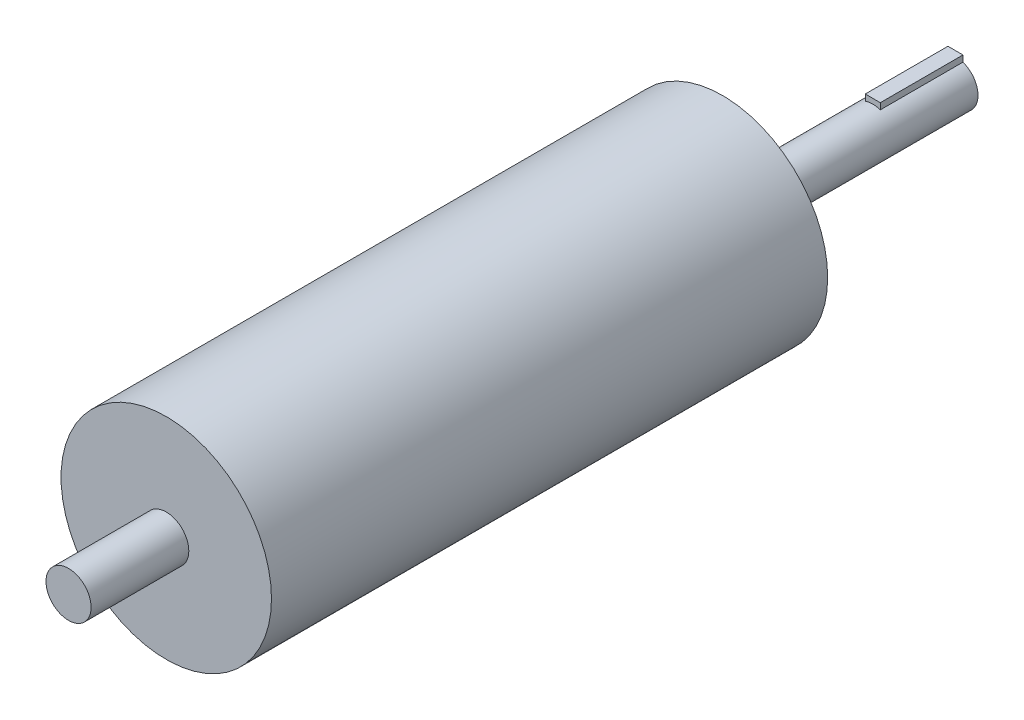
ISO-10303-21;
HEADER;
FILE_DESCRIPTION(('STEP AP214'),'2;1');
FILE_NAME('part.step','',(''),(''),'','','');
FILE_SCHEMA(('AUTOMOTIVE_DESIGN { 1 0 10303 214 1 1 1 1 }'));
ENDSEC;
DATA;
#1=APPLICATION_CONTEXT('core data for automotive mechanical design processes');
#2=APPLICATION_PROTOCOL_DEFINITION('international standard','automotive_design',2000,#1);
#3=PRODUCT_CONTEXT('',#1,'mechanical');
#4=PRODUCT('Part','Part','',(#3));
#5=PRODUCT_RELATED_PRODUCT_CATEGORY('part','',(#4));
#6=PRODUCT_DEFINITION_FORMATION('','',#4);
#7=PRODUCT_DEFINITION_CONTEXT('part definition',#1,'design');
#8=PRODUCT_DEFINITION('design','',#6,#7);
#9=PRODUCT_DEFINITION_SHAPE('','',#8);
#10=(LENGTH_UNIT() NAMED_UNIT(*) SI_UNIT(.MILLI.,.METRE.));
#11=(NAMED_UNIT(*) PLANE_ANGLE_UNIT() SI_UNIT($,.RADIAN.));
#12=(NAMED_UNIT(*) SI_UNIT($,.STERADIAN.) SOLID_ANGLE_UNIT());
#13=UNCERTAINTY_MEASURE_WITH_UNIT(LENGTH_MEASURE(1.E-05),#10,'distance_accuracy_value','');
#14=(GEOMETRIC_REPRESENTATION_CONTEXT(3) GLOBAL_UNCERTAINTY_ASSIGNED_CONTEXT((#13)) GLOBAL_UNIT_ASSIGNED_CONTEXT((#10,
#11,#12)) REPRESENTATION_CONTEXT('',''));
#15=CARTESIAN_POINT('',(0.,0.,0.));
#16=DIRECTION('',(0.,0.,1.));
#17=DIRECTION('',(1.,0.,0.));
#18=AXIS2_PLACEMENT_3D('',#15,#16,#17);
#19=CARTESIAN_POINT('',(0.,0.,435.));
#20=DIRECTION('',(0.,0.,-1.));
#21=DIRECTION('',(-1.,0.,0.));
#22=AXIS2_PLACEMENT_3D('',#19,#20,#21);
#23=CYLINDRICAL_SURFACE('',#22,15.);
#24=CARTESIAN_POINT('',(0.,0.,0.));
#25=DIRECTION('',(0.,0.,1.));
#26=DIRECTION('',(1.,0.,0.));
#27=AXIS2_PLACEMENT_3D('',#24,#25,#26);
#28=CIRCLE('',#27,15.);
#29=CARTESIAN_POINT('',(15.,0.,0.));
#30=VERTEX_POINT('',#29);
#31=EDGE_CURVE('E47',#30,#30,#28,.T.);
#32=ORIENTED_EDGE('',*,*,#31,.F.);
#33=EDGE_LOOP('',(#32));
#34=FACE_BOUND('',#33,.T.);
#35=CARTESIAN_POINT('',(0.,0.,-100.));
#36=DIRECTION('',(0.,0.,1.));
#37=DIRECTION('',(-1.,0.,0.));
#38=AXIS2_PLACEMENT_3D('',#35,#36,#37);
#39=CIRCLE('',#38,15.);
#40=CARTESIAN_POINT('',(5.,14.142135623731,-100.));
#41=VERTEX_POINT('',#40);
#42=CARTESIAN_POINT('',(-5.,14.142135623731,-100.));
#43=VERTEX_POINT('',#42);
#44=EDGE_CURVE('E105',#41,#43,#39,.T.);
#45=ORIENTED_EDGE('',*,*,#44,.T.);
#46=DIRECTION('',(0.,0.,1.));
#47=VECTOR('',#46,1.);
#48=CARTESIAN_POINT('',(-5.,14.142135623731,-155.));
#49=LINE('',#48,#47);
#50=CARTESIAN_POINT('',(-5.,14.142135623731,-155.));
#51=VERTEX_POINT('',#50);
#52=EDGE_CURVE('E95',#51,#43,#49,.T.);
#53=ORIENTED_EDGE('',*,*,#52,.F.);
#54=CARTESIAN_POINT('',(0.,0.,-155.));
#55=DIRECTION('',(0.,0.,-1.));
#56=DIRECTION('',(-1.,0.,0.));
#57=AXIS2_PLACEMENT_3D('',#54,#55,#56);
#58=CIRCLE('',#57,15.);
#59=CARTESIAN_POINT('',(5.,14.142135623731,-155.));
#60=VERTEX_POINT('',#59);
#61=EDGE_CURVE('E104',#60,#51,#58,.T.);
#62=ORIENTED_EDGE('',*,*,#61,.F.);
#63=DIRECTION('',(0.,0.,1.));
#64=VECTOR('',#63,1.);
#65=CARTESIAN_POINT('',(5.,14.142135623731,-155.));
#66=LINE('',#65,#64);
#67=EDGE_CURVE('E61',#60,#41,#66,.T.);
#68=ORIENTED_EDGE('',*,*,#67,.T.);
#69=EDGE_LOOP('',(#45,#53,#62,#68));
#70=FACE_BOUND('',#69,.T.);
#71=ADVANCED_FACE('F43',(#34,#70),#23,.T.);
#72=CARTESIAN_POINT('',(0.,0.,370.));
#73=DIRECTION('',(0.,0.,-1.));
#74=DIRECTION('',(-1.,0.,0.));
#75=AXIS2_PLACEMENT_3D('',#72,#73,#74);
#76=CYLINDRICAL_SURFACE('',#75,70.);
#77=CARTESIAN_POINT('',(0.,0.,370.));
#78=DIRECTION('',(0.,0.,1.));
#79=DIRECTION('',(1.,0.,0.));
#80=AXIS2_PLACEMENT_3D('',#77,#78,#79);
#81=CIRCLE('',#80,70.);
#82=CARTESIAN_POINT('',(70.,0.,370.));
#83=VERTEX_POINT('',#82);
#84=EDGE_CURVE('E53',#83,#83,#81,.T.);
#85=ORIENTED_EDGE('',*,*,#84,.F.);
#86=EDGE_LOOP('',(#85));
#87=FACE_BOUND('',#86,.T.);
#88=CARTESIAN_POINT('',(0.,0.,0.));
#89=DIRECTION('',(0.,0.,1.));
#90=DIRECTION('',(1.,0.,0.));
#91=AXIS2_PLACEMENT_3D('',#88,#89,#90);
#92=CIRCLE('',#91,70.);
#93=CARTESIAN_POINT('',(70.,0.,0.));
#94=VERTEX_POINT('',#93);
#95=EDGE_CURVE('E120',#94,#94,#92,.T.);
#96=ORIENTED_EDGE('',*,*,#95,.T.);
#97=EDGE_LOOP('',(#96));
#98=FACE_BOUND('',#97,.T.);
#99=ADVANCED_FACE('F45',(#87,#98),#76,.T.);
#100=CARTESIAN_POINT('',(0.,0.,370.));
#101=DIRECTION('',(0.,0.,1.));
#102=DIRECTION('',(1.,0.,0.));
#103=AXIS2_PLACEMENT_3D('',#100,#101,#102);
#104=PLANE('',#103);
#105=CARTESIAN_POINT('',(0.,0.,370.));
#106=DIRECTION('',(0.,0.,1.));
#107=DIRECTION('',(1.,0.,0.));
#108=AXIS2_PLACEMENT_3D('',#105,#106,#107);
#109=CIRCLE('',#108,15.);
#110=CARTESIAN_POINT('',(15.,0.,370.));
#111=VERTEX_POINT('',#110);
#112=EDGE_CURVE('E11',#111,#111,#109,.T.);
#113=ORIENTED_EDGE('',*,*,#112,.F.);
#114=EDGE_LOOP('',(#113));
#115=FACE_BOUND('',#114,.T.);
#116=ORIENTED_EDGE('',*,*,#84,.T.);
#117=EDGE_LOOP('',(#116));
#118=FACE_BOUND('',#117,.T.);
#119=ADVANCED_FACE('F138',(#115,#118),#104,.T.);
#120=CARTESIAN_POINT('',(0.,0.,0.));
#121=DIRECTION('',(0.,0.,1.));
#122=DIRECTION('',(1.,0.,0.));
#123=AXIS2_PLACEMENT_3D('',#120,#121,#122);
#124=PLANE('',#123);
#125=ORIENTED_EDGE('',*,*,#31,.T.);
#126=EDGE_LOOP('',(#125));
#127=FACE_BOUND('',#126,.T.);
#128=ORIENTED_EDGE('',*,*,#95,.F.);
#129=EDGE_LOOP('',(#128));
#130=FACE_BOUND('',#129,.T.);
#131=ADVANCED_FACE('F129',(#127,#130),#124,.F.);
#132=ORIENTED_EDGE('',*,*,#112,.T.);
#133=EDGE_LOOP('',(#132));
#134=FACE_BOUND('',#133,.T.);
#135=CARTESIAN_POINT('',(0.,0.,435.));
#136=DIRECTION('',(0.,0.,-1.));
#137=DIRECTION('',(-1.,0.,0.));
#138=AXIS2_PLACEMENT_3D('',#135,#136,#137);
#139=CIRCLE('',#138,15.);
#140=CARTESIAN_POINT('',(-15.,0.,435.));
#141=VERTEX_POINT('',#140);
#142=EDGE_CURVE('E111',#141,#141,#139,.T.);
#143=ORIENTED_EDGE('',*,*,#142,.T.);
#144=EDGE_LOOP('',(#143));
#145=FACE_BOUND('',#144,.T.);
#146=ADVANCED_FACE('F134',(#134,#145),#23,.T.);
#147=CARTESIAN_POINT('',(0.,0.,435.));
#148=DIRECTION('',(0.,0.,1.));
#149=DIRECTION('',(1.,0.,0.));
#150=AXIS2_PLACEMENT_3D('',#147,#148,#149);
#151=PLANE('',#150);
#152=ORIENTED_EDGE('',*,*,#142,.F.);
#153=EDGE_LOOP('',(#152));
#154=FACE_BOUND('',#153,.T.);
#155=ADVANCED_FACE('F143',(#154),#151,.T.);
#156=CARTESIAN_POINT('',(0.,0.,-155.));
#157=DIRECTION('',(0.,0.,-1.));
#158=DIRECTION('',(-1.,0.,0.));
#159=AXIS2_PLACEMENT_3D('',#156,#157,#158);
#160=PLANE('',#159);
#161=ORIENTED_EDGE('',*,*,#61,.T.);
#162=DIRECTION('',(0.,1.,0.));
#163=VECTOR('',#162,1.);
#164=CARTESIAN_POINT('',(-5.,18.302135623731,-155.));
#165=LINE('',#164,#163);
#166=CARTESIAN_POINT('',(-5.,18.302135623731,-155.));
#167=VERTEX_POINT('',#166);
#168=EDGE_CURVE('E92',#51,#167,#165,.T.);
#169=ORIENTED_EDGE('',*,*,#168,.T.);
#170=DIRECTION('',(1.,0.,0.));
#171=VECTOR('',#170,1.);
#172=CARTESIAN_POINT('',(5.,18.302135623731,-155.));
#173=LINE('',#172,#171);
#174=CARTESIAN_POINT('',(5.,18.302135623731,-155.));
#175=VERTEX_POINT('',#174);
#176=EDGE_CURVE('E69',#167,#175,#173,.T.);
#177=ORIENTED_EDGE('',*,*,#176,.T.);
#178=DIRECTION('',(0.,-1.,0.));
#179=VECTOR('',#178,1.);
#180=CARTESIAN_POINT('',(5.,14.142135623731,-155.));
#181=LINE('',#180,#179);
#182=EDGE_CURVE('E109',#175,#60,#181,.T.);
#183=ORIENTED_EDGE('',*,*,#182,.T.);
#184=EDGE_LOOP('',(#161,#169,#177,#183));
#185=FACE_BOUND('',#184,.T.);
#186=ADVANCED_FACE('F108',(#185),#160,.T.);
#187=CARTESIAN_POINT('',(-5.,18.302135623731,-155.));
#188=DIRECTION('',(1.,0.,0.));
#189=DIRECTION('',(0.,0.,-1.));
#190=AXIS2_PLACEMENT_3D('',#187,#188,#189);
#191=PLANE('',#190);
#192=DIRECTION('',(0.,1.,0.));
#193=VECTOR('',#192,1.);
#194=CARTESIAN_POINT('',(-5.,18.302135623731,-100.));
#195=LINE('',#194,#193);
#196=CARTESIAN_POINT('',(-5.,18.302135623731,-100.));
#197=VERTEX_POINT('',#196);
#198=EDGE_CURVE('E266',#43,#197,#195,.T.);
#199=ORIENTED_EDGE('',*,*,#198,.T.);
#200=DIRECTION('',(0.,0.,1.));
#201=VECTOR('',#200,1.);
#202=CARTESIAN_POINT('',(-5.,18.302135623731,-155.));
#203=LINE('',#202,#201);
#204=EDGE_CURVE('E98',#167,#197,#203,.T.);
#205=ORIENTED_EDGE('',*,*,#204,.F.);
#206=ORIENTED_EDGE('',*,*,#168,.F.);
#207=ORIENTED_EDGE('',*,*,#52,.T.);
#208=EDGE_LOOP('',(#199,#205,#206,#207));
#209=FACE_BOUND('',#208,.T.);
#210=ADVANCED_FACE('F94',(#209),#191,.F.);
#211=CARTESIAN_POINT('',(5.,18.302135623731,-155.));
#212=DIRECTION('',(0.,-1.,0.));
#213=DIRECTION('',(0.,0.,-1.));
#214=AXIS2_PLACEMENT_3D('',#211,#212,#213);
#215=PLANE('',#214);
#216=DIRECTION('',(1.,0.,0.));
#217=VECTOR('',#216,1.);
#218=CARTESIAN_POINT('',(5.,18.302135623731,-100.));
#219=LINE('',#218,#217);
#220=CARTESIAN_POINT('',(5.,18.302135623731,-100.));
#221=VERTEX_POINT('',#220);
#222=EDGE_CURVE('E279',#197,#221,#219,.T.);
#223=ORIENTED_EDGE('',*,*,#222,.T.);
#224=DIRECTION('',(0.,0.,1.));
#225=VECTOR('',#224,1.);
#226=CARTESIAN_POINT('',(5.,18.302135623731,-155.));
#227=LINE('',#226,#225);
#228=EDGE_CURVE('E270',#175,#221,#227,.T.);
#229=ORIENTED_EDGE('',*,*,#228,.F.);
#230=ORIENTED_EDGE('',*,*,#176,.F.);
#231=ORIENTED_EDGE('',*,*,#204,.T.);
#232=EDGE_LOOP('',(#223,#229,#230,#231));
#233=FACE_BOUND('',#232,.T.);
#234=ADVANCED_FACE('F202',(#233),#215,.F.);
#235=CARTESIAN_POINT('',(5.,14.142135623731,-155.));
#236=DIRECTION('',(-1.,0.,0.));
#237=DIRECTION('',(0.,0.,1.));
#238=AXIS2_PLACEMENT_3D('',#235,#236,#237);
#239=PLANE('',#238);
#240=DIRECTION('',(0.,-1.,0.));
#241=VECTOR('',#240,1.);
#242=CARTESIAN_POINT('',(5.,14.142135623731,-100.));
#243=LINE('',#242,#241);
#244=EDGE_CURVE('E86',#221,#41,#243,.T.);
#245=ORIENTED_EDGE('',*,*,#244,.T.);
#246=ORIENTED_EDGE('',*,*,#67,.F.);
#247=ORIENTED_EDGE('',*,*,#182,.F.);
#248=ORIENTED_EDGE('',*,*,#228,.T.);
#249=EDGE_LOOP('',(#245,#246,#247,#248));
#250=FACE_BOUND('',#249,.T.);
#251=ADVANCED_FACE('F211',(#250),#239,.F.);
#252=CARTESIAN_POINT('',(0.,0.,-100.));
#253=DIRECTION('',(0.,0.,-1.));
#254=DIRECTION('',(-1.,0.,0.));
#255=AXIS2_PLACEMENT_3D('',#252,#253,#254);
#256=PLANE('',#255);
#257=ORIENTED_EDGE('',*,*,#44,.F.);
#258=ORIENTED_EDGE('',*,*,#244,.F.);
#259=ORIENTED_EDGE('',*,*,#222,.F.);
#260=ORIENTED_EDGE('',*,*,#198,.F.);
#261=EDGE_LOOP('',(#257,#258,#259,#260));
#262=FACE_BOUND('',#261,.T.);
#263=ADVANCED_FACE('F221',(#262),#256,.F.);
#264=CLOSED_SHELL('',(#71,#99,#119,#131,#146,#155,#186,#210,#234,#251,#263));
#265=MANIFOLD_SOLID_BREP('B2',#264);
#266=ADVANCED_BREP_SHAPE_REPRESENTATION('',(#18,#265),#14);
#267=SHAPE_DEFINITION_REPRESENTATION(#9,#266);
ENDSEC;
END-ISO-10303-21;
